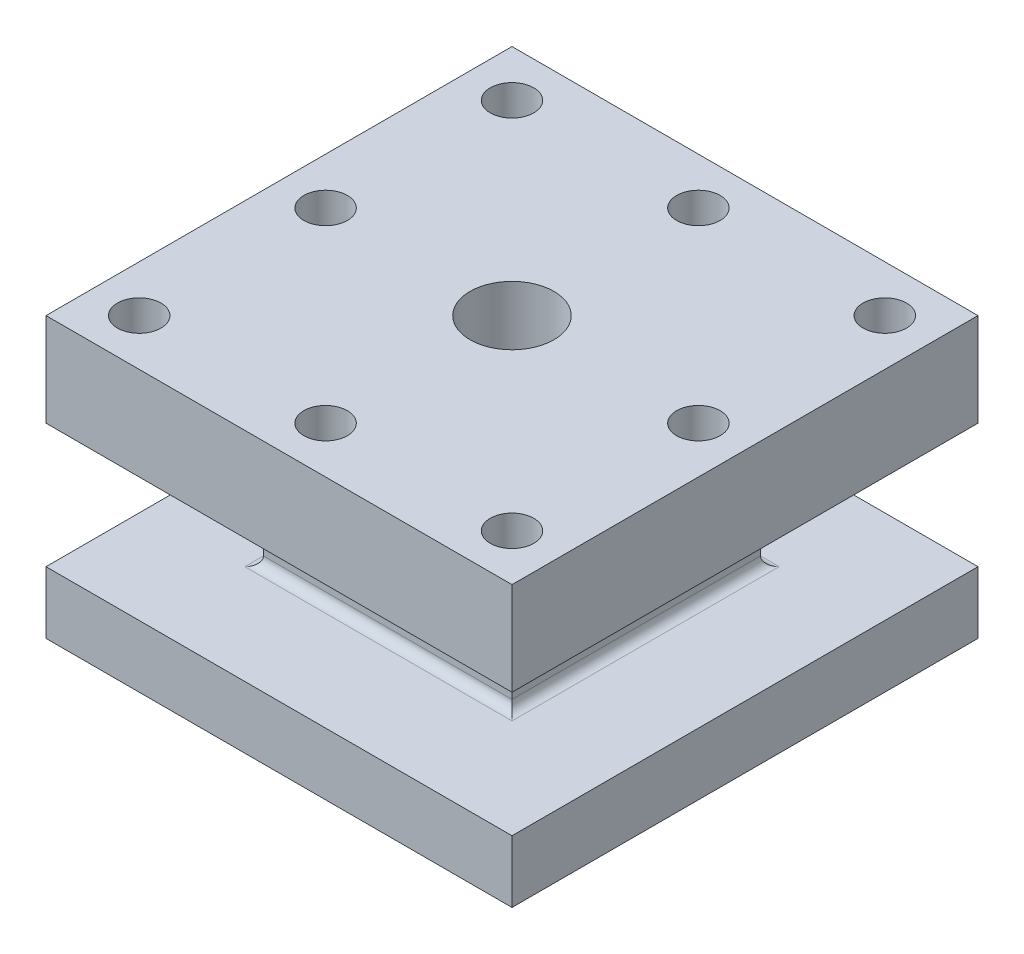
ISO-10303-21;
HEADER;
FILE_DESCRIPTION(('STEP AP214'),'2;1');
FILE_NAME('part.step','',(''),(''),'','','');
FILE_SCHEMA(('AUTOMOTIVE_DESIGN { 1 0 10303 214 1 1 1 1 }'));
ENDSEC;
DATA;
#1=APPLICATION_CONTEXT('core data for automotive mechanical design processes');
#2=APPLICATION_PROTOCOL_DEFINITION('international standard','automotive_design',2000,#1);
#3=PRODUCT_CONTEXT('',#1,'mechanical');
#4=PRODUCT('Part','Part','',(#3));
#5=PRODUCT_RELATED_PRODUCT_CATEGORY('part','',(#4));
#6=PRODUCT_DEFINITION_FORMATION('','',#4);
#7=PRODUCT_DEFINITION_CONTEXT('part definition',#1,'design');
#8=PRODUCT_DEFINITION('design','',#6,#7);
#9=PRODUCT_DEFINITION_SHAPE('','',#8);
#10=(LENGTH_UNIT() NAMED_UNIT(*) SI_UNIT(.MILLI.,.METRE.));
#11=(NAMED_UNIT(*) PLANE_ANGLE_UNIT() SI_UNIT($,.RADIAN.));
#12=(NAMED_UNIT(*) SI_UNIT($,.STERADIAN.) SOLID_ANGLE_UNIT());
#13=UNCERTAINTY_MEASURE_WITH_UNIT(LENGTH_MEASURE(1.E-05),#10,'distance_accuracy_value','');
#14=(GEOMETRIC_REPRESENTATION_CONTEXT(3) GLOBAL_UNCERTAINTY_ASSIGNED_CONTEXT((#13)) GLOBAL_UNIT_ASSIGNED_CONTEXT((#10,
#11,#12)) REPRESENTATION_CONTEXT('',''));
#15=CARTESIAN_POINT('',(0.,0.,0.));
#16=DIRECTION('',(0.,0.,1.));
#17=DIRECTION('',(1.,0.,0.));
#18=AXIS2_PLACEMENT_3D('',#15,#16,#17);
#19=CARTESIAN_POINT('',(0.,0.,0.));
#20=DIRECTION('',(0.,-1.,0.));
#21=DIRECTION('',(0.,0.,-1.));
#22=AXIS2_PLACEMENT_3D('',#19,#20,#21);
#23=PLANE('',#22);
#24=CARTESIAN_POINT('',(0.,0.,60.));
#25=DIRECTION('',(0.,1.,0.));
#26=DIRECTION('',(0.,0.,1.));
#27=AXIS2_PLACEMENT_3D('',#24,#25,#26);
#28=CIRCLE('',#27,6.99999999999999);
#29=CARTESIAN_POINT('',(0.,0.,67.));
#30=VERTEX_POINT('',#29);
#31=EDGE_CURVE('E248',#30,#30,#28,.T.);
#32=ORIENTED_EDGE('',*,*,#31,.F.);
#33=EDGE_LOOP('',(#32));
#34=FACE_BOUND('',#33,.T.);
#35=CARTESIAN_POINT('',(0.,0.,0.));
#36=DIRECTION('',(0.,-1.,0.));
#37=DIRECTION('',(0.,0.,-1.));
#38=AXIS2_PLACEMENT_3D('',#35,#36,#37);
#39=CIRCLE('',#38,13.5);
#40=CARTESIAN_POINT('',(0.,0.,-13.5));
#41=VERTEX_POINT('',#40);
#42=EDGE_CURVE('E272',#41,#41,#39,.T.);
#43=ORIENTED_EDGE('',*,*,#42,.T.);
#44=EDGE_LOOP('',(#43));
#45=FACE_BOUND('',#44,.T.);
#46=DIRECTION('',(0.,0.,1.));
#47=VECTOR('',#46,1.);
#48=CARTESIAN_POINT('',(-75.,0.,-75.));
#49=LINE('',#48,#47);
#50=CARTESIAN_POINT('',(-75.,0.,-75.));
#51=VERTEX_POINT('',#50);
#52=CARTESIAN_POINT('',(-75.,0.,75.));
#53=VERTEX_POINT('',#52);
#54=EDGE_CURVE('E346',#51,#53,#49,.T.);
#55=ORIENTED_EDGE('',*,*,#54,.T.);
#56=DIRECTION('',(1.,0.,0.));
#57=VECTOR('',#56,1.);
#58=CARTESIAN_POINT('',(75.,0.,75.));
#59=LINE('',#58,#57);
#60=CARTESIAN_POINT('',(75.,0.,75.));
#61=VERTEX_POINT('',#60);
#62=EDGE_CURVE('E368',#53,#61,#59,.T.);
#63=ORIENTED_EDGE('',*,*,#62,.T.);
#64=DIRECTION('',(0.,0.,-1.));
#65=VECTOR('',#64,1.);
#66=CARTESIAN_POINT('',(75.,0.,-75.));
#67=LINE('',#66,#65);
#68=CARTESIAN_POINT('',(75.,0.,-75.));
#69=VERTEX_POINT('',#68);
#70=EDGE_CURVE('E372',#61,#69,#67,.T.);
#71=ORIENTED_EDGE('',*,*,#70,.T.);
#72=DIRECTION('',(-1.,0.,0.));
#73=VECTOR('',#72,1.);
#74=CARTESIAN_POINT('',(75.,0.,-75.));
#75=LINE('',#74,#73);
#76=EDGE_CURVE('E352',#69,#51,#75,.T.);
#77=ORIENTED_EDGE('',*,*,#76,.T.);
#78=EDGE_LOOP('',(#55,#63,#71,#77));
#79=FACE_BOUND('',#78,.T.);
#80=CARTESIAN_POINT('',(-60.,0.,0.));
#81=DIRECTION('',(0.,1.,0.));
#82=DIRECTION('',(0.,0.,1.));
#83=AXIS2_PLACEMENT_3D('',#80,#81,#82);
#84=CIRCLE('',#83,6.99999999999999);
#85=CARTESIAN_POINT('',(-60.,0.,6.99999999999998));
#86=VERTEX_POINT('',#85);
#87=EDGE_CURVE('E256',#86,#86,#84,.T.);
#88=ORIENTED_EDGE('',*,*,#87,.F.);
#89=EDGE_LOOP('',(#88));
#90=FACE_BOUND('',#89,.T.);
#91=CARTESIAN_POINT('',(60.,0.,0.));
#92=DIRECTION('',(0.,1.,0.));
#93=DIRECTION('',(0.,0.,1.));
#94=AXIS2_PLACEMENT_3D('',#91,#92,#93);
#95=CIRCLE('',#94,6.99999999999999);
#96=CARTESIAN_POINT('',(60.,0.,6.99999999999997));
#97=VERTEX_POINT('',#96);
#98=EDGE_CURVE('E240',#97,#97,#95,.T.);
#99=ORIENTED_EDGE('',*,*,#98,.F.);
#100=EDGE_LOOP('',(#99));
#101=FACE_BOUND('',#100,.T.);
#102=CARTESIAN_POINT('',(0.,0.,-60.));
#103=DIRECTION('',(0.,1.,0.));
#104=DIRECTION('',(0.,0.,1.));
#105=AXIS2_PLACEMENT_3D('',#102,#103,#104);
#106=CIRCLE('',#105,6.99999999999999);
#107=CARTESIAN_POINT('',(0.,0.,-53.));
#108=VERTEX_POINT('',#107);
#109=EDGE_CURVE('E232',#108,#108,#106,.T.);
#110=ORIENTED_EDGE('',*,*,#109,.F.);
#111=EDGE_LOOP('',(#110));
#112=FACE_BOUND('',#111,.T.);
#113=CARTESIAN_POINT('',(-60.,0.,-60.));
#114=DIRECTION('',(0.,1.,0.));
#115=DIRECTION('',(0.,0.,1.));
#116=AXIS2_PLACEMENT_3D('',#113,#114,#115);
#117=CIRCLE('',#116,6.99999999999999);
#118=CARTESIAN_POINT('',(-60.,0.,-53.));
#119=VERTEX_POINT('',#118);
#120=EDGE_CURVE('E224',#119,#119,#117,.T.);
#121=ORIENTED_EDGE('',*,*,#120,.F.);
#122=EDGE_LOOP('',(#121));
#123=FACE_BOUND('',#122,.T.);
#124=CARTESIAN_POINT('',(60.,0.,60.));
#125=DIRECTION('',(0.,1.,0.));
#126=DIRECTION('',(0.,0.,1.));
#127=AXIS2_PLACEMENT_3D('',#124,#125,#126);
#128=CIRCLE('',#127,6.99999999999999);
#129=CARTESIAN_POINT('',(60.,0.,67.));
#130=VERTEX_POINT('',#129);
#131=EDGE_CURVE('E216',#130,#130,#128,.T.);
#132=ORIENTED_EDGE('',*,*,#131,.F.);
#133=EDGE_LOOP('',(#132));
#134=FACE_BOUND('',#133,.T.);
#135=CARTESIAN_POINT('',(60.,0.,-60.));
#136=DIRECTION('',(0.,1.,0.));
#137=DIRECTION('',(0.,0.,1.));
#138=AXIS2_PLACEMENT_3D('',#135,#136,#137);
#139=CIRCLE('',#138,6.99999999999999);
#140=CARTESIAN_POINT('',(60.,0.,-53.));
#141=VERTEX_POINT('',#140);
#142=EDGE_CURVE('E208',#141,#141,#139,.T.);
#143=ORIENTED_EDGE('',*,*,#142,.F.);
#144=EDGE_LOOP('',(#143));
#145=FACE_BOUND('',#144,.T.);
#146=CARTESIAN_POINT('',(-60.,0.,60.));
#147=DIRECTION('',(0.,1.,0.));
#148=DIRECTION('',(0.,0.,1.));
#149=AXIS2_PLACEMENT_3D('',#146,#147,#148);
#150=CIRCLE('',#149,6.99999999999999);
#151=CARTESIAN_POINT('',(-60.,0.,67.));
#152=VERTEX_POINT('',#151);
#153=EDGE_CURVE('E200',#152,#152,#150,.T.);
#154=ORIENTED_EDGE('',*,*,#153,.F.);
#155=EDGE_LOOP('',(#154));
#156=FACE_BOUND('',#155,.T.);
#157=ADVANCED_FACE('F44',(#34,#45,#79,#90,#101,#112,#123,#134,#145,#156),#23,.F.);
#158=CARTESIAN_POINT('',(-75.,-30.,-75.));
#159=DIRECTION('',(-1.,0.,0.));
#160=DIRECTION('',(0.,0.,1.));
#161=AXIS2_PLACEMENT_3D('',#158,#159,#160);
#162=PLANE('',#161);
#163=ORIENTED_EDGE('',*,*,#54,.F.);
#164=DIRECTION('',(0.,1.,0.));
#165=VECTOR('',#164,1.);
#166=CARTESIAN_POINT('',(-75.,-30.,-75.));
#167=LINE('',#166,#165);
#168=CARTESIAN_POINT('',(-75.,-30.,-75.));
#169=VERTEX_POINT('',#168);
#170=EDGE_CURVE('E379',#169,#51,#167,.T.);
#171=ORIENTED_EDGE('',*,*,#170,.F.);
#172=DIRECTION('',(0.,0.,1.));
#173=VECTOR('',#172,1.);
#174=CARTESIAN_POINT('',(-75.,-30.,-75.));
#175=LINE('',#174,#173);
#176=CARTESIAN_POINT('',(-75.,-30.,75.));
#177=VERTEX_POINT('',#176);
#178=EDGE_CURVE('E347',#169,#177,#175,.T.);
#179=ORIENTED_EDGE('',*,*,#178,.T.);
#180=DIRECTION('',(0.,1.,0.));
#181=VECTOR('',#180,1.);
#182=CARTESIAN_POINT('',(-75.,-30.,75.));
#183=LINE('',#182,#181);
#184=EDGE_CURVE('E364',#177,#53,#183,.T.);
#185=ORIENTED_EDGE('',*,*,#184,.T.);
#186=EDGE_LOOP('',(#163,#171,#179,#185));
#187=FACE_BOUND('',#186,.T.);
#188=ADVANCED_FACE('F444',(#187),#162,.T.);
#189=CARTESIAN_POINT('',(75.,-30.,-75.));
#190=DIRECTION('',(0.,0.,-1.));
#191=DIRECTION('',(-1.,0.,0.));
#192=AXIS2_PLACEMENT_3D('',#189,#190,#191);
#193=PLANE('',#192);
#194=ORIENTED_EDGE('',*,*,#76,.F.);
#195=DIRECTION('',(0.,1.,0.));
#196=VECTOR('',#195,1.);
#197=CARTESIAN_POINT('',(75.,-30.,-75.));
#198=LINE('',#197,#196);
#199=CARTESIAN_POINT('',(75.,-30.,-75.));
#200=VERTEX_POINT('',#199);
#201=EDGE_CURVE('E383',#200,#69,#198,.T.);
#202=ORIENTED_EDGE('',*,*,#201,.F.);
#203=DIRECTION('',(-1.,0.,0.));
#204=VECTOR('',#203,1.);
#205=CARTESIAN_POINT('',(75.,-30.,-75.));
#206=LINE('',#205,#204);
#207=EDGE_CURVE('E360',#200,#169,#206,.T.);
#208=ORIENTED_EDGE('',*,*,#207,.T.);
#209=ORIENTED_EDGE('',*,*,#170,.T.);
#210=EDGE_LOOP('',(#194,#202,#208,#209));
#211=FACE_BOUND('',#210,.T.);
#212=ADVANCED_FACE('F450',(#211),#193,.T.);
#213=CARTESIAN_POINT('',(75.,-30.,-75.));
#214=DIRECTION('',(1.,0.,0.));
#215=DIRECTION('',(0.,0.,-1.));
#216=AXIS2_PLACEMENT_3D('',#213,#214,#215);
#217=PLANE('',#216);
#218=ORIENTED_EDGE('',*,*,#70,.F.);
#219=DIRECTION('',(0.,1.,0.));
#220=VECTOR('',#219,1.);
#221=CARTESIAN_POINT('',(75.,-30.,75.));
#222=LINE('',#221,#220);
#223=CARTESIAN_POINT('',(75.,-30.,75.));
#224=VERTEX_POINT('',#223);
#225=EDGE_CURVE('E386',#224,#61,#222,.T.);
#226=ORIENTED_EDGE('',*,*,#225,.F.);
#227=DIRECTION('',(0.,0.,-1.));
#228=VECTOR('',#227,1.);
#229=CARTESIAN_POINT('',(75.,-30.,-75.));
#230=LINE('',#229,#228);
#231=EDGE_CURVE('E356',#224,#200,#230,.T.);
#232=ORIENTED_EDGE('',*,*,#231,.T.);
#233=ORIENTED_EDGE('',*,*,#201,.T.);
#234=EDGE_LOOP('',(#218,#226,#232,#233));
#235=FACE_BOUND('',#234,.T.);
#236=ADVANCED_FACE('F461',(#235),#217,.T.);
#237=CARTESIAN_POINT('',(75.,-30.,75.));
#238=DIRECTION('',(0.,0.,1.));
#239=DIRECTION('',(1.,0.,0.));
#240=AXIS2_PLACEMENT_3D('',#237,#238,#239);
#241=PLANE('',#240);
#242=ORIENTED_EDGE('',*,*,#62,.F.);
#243=ORIENTED_EDGE('',*,*,#184,.F.);
#244=DIRECTION('',(1.,0.,0.));
#245=VECTOR('',#244,1.);
#246=CARTESIAN_POINT('',(75.,-30.,75.));
#247=LINE('',#246,#245);
#248=EDGE_CURVE('E351',#177,#224,#247,.T.);
#249=ORIENTED_EDGE('',*,*,#248,.T.);
#250=ORIENTED_EDGE('',*,*,#225,.T.);
#251=EDGE_LOOP('',(#242,#243,#249,#250));
#252=FACE_BOUND('',#251,.T.);
#253=ADVANCED_FACE('F465',(#252),#241,.T.);
#254=CARTESIAN_POINT('',(0.,-30.,0.));
#255=DIRECTION('',(0.,-1.,0.));
#256=DIRECTION('',(0.,0.,-1.));
#257=AXIS2_PLACEMENT_3D('',#254,#255,#256);
#258=PLANE('',#257);
#259=CARTESIAN_POINT('',(-60.,-30.,60.));
#260=DIRECTION('',(0.,-1.,0.));
#261=DIRECTION('',(0.,0.,-1.));
#262=AXIS2_PLACEMENT_3D('',#259,#260,#261);
#263=CIRCLE('',#262,6.99999999999999);
#264=CARTESIAN_POINT('',(-60.,-30.,53.));
#265=VERTEX_POINT('',#264);
#266=EDGE_CURVE('E204',#265,#265,#263,.T.);
#267=ORIENTED_EDGE('',*,*,#266,.F.);
#268=EDGE_LOOP('',(#267));
#269=FACE_BOUND('',#268,.T.);
#270=CARTESIAN_POINT('',(60.,-30.,-60.));
#271=DIRECTION('',(0.,-1.,0.));
#272=DIRECTION('',(0.,0.,-1.));
#273=AXIS2_PLACEMENT_3D('',#270,#271,#272);
#274=CIRCLE('',#273,6.99999999999999);
#275=CARTESIAN_POINT('',(60.,-30.,-67.));
#276=VERTEX_POINT('',#275);
#277=EDGE_CURVE('E212',#276,#276,#274,.T.);
#278=ORIENTED_EDGE('',*,*,#277,.F.);
#279=EDGE_LOOP('',(#278));
#280=FACE_BOUND('',#279,.T.);
#281=CARTESIAN_POINT('',(60.,-30.,60.));
#282=DIRECTION('',(0.,-1.,0.));
#283=DIRECTION('',(0.,0.,-1.));
#284=AXIS2_PLACEMENT_3D('',#281,#282,#283);
#285=CIRCLE('',#284,6.99999999999999);
#286=CARTESIAN_POINT('',(60.,-30.,53.));
#287=VERTEX_POINT('',#286);
#288=EDGE_CURVE('E220',#287,#287,#285,.T.);
#289=ORIENTED_EDGE('',*,*,#288,.F.);
#290=EDGE_LOOP('',(#289));
#291=FACE_BOUND('',#290,.T.);
#292=CARTESIAN_POINT('',(-60.,-30.,-60.));
#293=DIRECTION('',(0.,-1.,0.));
#294=DIRECTION('',(0.,0.,-1.));
#295=AXIS2_PLACEMENT_3D('',#292,#293,#294);
#296=CIRCLE('',#295,6.99999999999999);
#297=CARTESIAN_POINT('',(-60.,-30.,-67.));
#298=VERTEX_POINT('',#297);
#299=EDGE_CURVE('E228',#298,#298,#296,.T.);
#300=ORIENTED_EDGE('',*,*,#299,.F.);
#301=EDGE_LOOP('',(#300));
#302=FACE_BOUND('',#301,.T.);
#303=CARTESIAN_POINT('',(0.,-30.,-60.));
#304=DIRECTION('',(0.,-1.,0.));
#305=DIRECTION('',(0.,0.,-1.));
#306=AXIS2_PLACEMENT_3D('',#303,#304,#305);
#307=CIRCLE('',#306,6.99999999999999);
#308=CARTESIAN_POINT('',(0.,-30.,-67.));
#309=VERTEX_POINT('',#308);
#310=EDGE_CURVE('E236',#309,#309,#307,.T.);
#311=ORIENTED_EDGE('',*,*,#310,.F.);
#312=EDGE_LOOP('',(#311));
#313=FACE_BOUND('',#312,.T.);
#314=CARTESIAN_POINT('',(60.,-30.,0.));
#315=DIRECTION('',(0.,-1.,0.));
#316=DIRECTION('',(0.,0.,-1.));
#317=AXIS2_PLACEMENT_3D('',#314,#315,#316);
#318=CIRCLE('',#317,6.99999999999999);
#319=CARTESIAN_POINT('',(60.,-30.,-7.00000000000001));
#320=VERTEX_POINT('',#319);
#321=EDGE_CURVE('E244',#320,#320,#318,.T.);
#322=ORIENTED_EDGE('',*,*,#321,.F.);
#323=EDGE_LOOP('',(#322));
#324=FACE_BOUND('',#323,.T.);
#325=CARTESIAN_POINT('',(0.,-30.,60.));
#326=DIRECTION('',(0.,-1.,0.));
#327=DIRECTION('',(0.,0.,-1.));
#328=AXIS2_PLACEMENT_3D('',#325,#326,#327);
#329=CIRCLE('',#328,6.99999999999999);
#330=CARTESIAN_POINT('',(0.,-30.,53.));
#331=VERTEX_POINT('',#330);
#332=EDGE_CURVE('E252',#331,#331,#329,.T.);
#333=ORIENTED_EDGE('',*,*,#332,.F.);
#334=EDGE_LOOP('',(#333));
#335=FACE_BOUND('',#334,.T.);
#336=CARTESIAN_POINT('',(-60.,-30.,0.));
#337=DIRECTION('',(0.,-1.,0.));
#338=DIRECTION('',(0.,0.,-1.));
#339=AXIS2_PLACEMENT_3D('',#336,#337,#338);
#340=CIRCLE('',#339,6.99999999999999);
#341=CARTESIAN_POINT('',(-60.,-30.,-6.99999999999999));
#342=VERTEX_POINT('',#341);
#343=EDGE_CURVE('E260',#342,#342,#340,.T.);
#344=ORIENTED_EDGE('',*,*,#343,.F.);
#345=EDGE_LOOP('',(#344));
#346=FACE_BOUND('',#345,.T.);
#347=DIRECTION('',(0.,0.,-1.));
#348=VECTOR('',#347,1.);
#349=CARTESIAN_POINT('',(-40.,-30.,40.));
#350=LINE('',#349,#348);
#351=CARTESIAN_POINT('',(-40.,-30.,40.));
#352=VERTEX_POINT('',#351);
#353=CARTESIAN_POINT('',(-40.,-30.,-40.));
#354=VERTEX_POINT('',#353);
#355=EDGE_CURVE('E318',#352,#354,#350,.T.);
#356=ORIENTED_EDGE('',*,*,#355,.F.);
#357=DIRECTION('',(-1.,0.,0.));
#358=VECTOR('',#357,1.);
#359=CARTESIAN_POINT('',(40.,-30.,40.));
#360=LINE('',#359,#358);
#361=CARTESIAN_POINT('',(40.,-30.,40.));
#362=VERTEX_POINT('',#361);
#363=EDGE_CURVE('E330',#362,#352,#360,.T.);
#364=ORIENTED_EDGE('',*,*,#363,.F.);
#365=DIRECTION('',(0.,0.,1.));
#366=VECTOR('',#365,1.);
#367=CARTESIAN_POINT('',(40.,-30.,40.));
#368=LINE('',#367,#366);
#369=CARTESIAN_POINT('',(40.,-30.,-40.));
#370=VERTEX_POINT('',#369);
#371=EDGE_CURVE('E326',#370,#362,#368,.T.);
#372=ORIENTED_EDGE('',*,*,#371,.F.);
#373=DIRECTION('',(1.,0.,0.));
#374=VECTOR('',#373,1.);
#375=CARTESIAN_POINT('',(40.,-30.,-40.));
#376=LINE('',#375,#374);
#377=EDGE_CURVE('E322',#354,#370,#376,.T.);
#378=ORIENTED_EDGE('',*,*,#377,.F.);
#379=EDGE_LOOP('',(#356,#364,#372,#378));
#380=FACE_BOUND('',#379,.T.);
#381=ORIENTED_EDGE('',*,*,#178,.F.);
#382=ORIENTED_EDGE('',*,*,#207,.F.);
#383=ORIENTED_EDGE('',*,*,#231,.F.);
#384=ORIENTED_EDGE('',*,*,#248,.F.);
#385=EDGE_LOOP('',(#381,#382,#383,#384));
#386=FACE_BOUND('',#385,.T.);
#387=ADVANCED_FACE('F457',(#269,#280,#291,#302,#313,#324,#335,#346,#380,#386),#258,.T.);
#388=CARTESIAN_POINT('',(-40.,-70.,40.));
#389=DIRECTION('',(1.,0.,0.));
#390=DIRECTION('',(0.,0.,-1.));
#391=AXIS2_PLACEMENT_3D('',#388,#389,#390);
#392=PLANE('',#391);
#393=DIRECTION('',(0.,1.,0.));
#394=VECTOR('',#393,1.);
#395=CARTESIAN_POINT('',(-40.,-70.,-40.));
#396=LINE('',#395,#394);
#397=CARTESIAN_POINT('',(-40.,-67.,-40.));
#398=VERTEX_POINT('',#397);
#399=EDGE_CURVE('E343',#398,#354,#396,.T.);
#400=ORIENTED_EDGE('',*,*,#399,.F.);
#401=DIRECTION('',(0.,0.,-1.));
#402=VECTOR('',#401,1.);
#403=CARTESIAN_POINT('',(-40.,-67.,40.));
#404=LINE('',#403,#402);
#405=CARTESIAN_POINT('',(-40.,-67.,40.));
#406=VERTEX_POINT('',#405);
#407=EDGE_CURVE('E69',#398,#406,#404,.F.);
#408=ORIENTED_EDGE('',*,*,#407,.T.);
#409=DIRECTION('',(0.,1.,0.));
#410=VECTOR('',#409,1.);
#411=CARTESIAN_POINT('',(-40.,-70.,40.));
#412=LINE('',#411,#410);
#413=EDGE_CURVE('E334',#406,#352,#412,.T.);
#414=ORIENTED_EDGE('',*,*,#413,.T.);
#415=ORIENTED_EDGE('',*,*,#355,.T.);
#416=EDGE_LOOP('',(#400,#408,#414,#415));
#417=FACE_BOUND('',#416,.T.);
#418=ADVANCED_FACE('F554',(#417),#392,.F.);
#419=CARTESIAN_POINT('',(40.,-70.,-40.));
#420=DIRECTION('',(0.,0.,1.));
#421=DIRECTION('',(1.,0.,0.));
#422=AXIS2_PLACEMENT_3D('',#419,#420,#421);
#423=PLANE('',#422);
#424=DIRECTION('',(0.,1.,0.));
#425=VECTOR('',#424,1.);
#426=CARTESIAN_POINT('',(40.,-70.,-40.));
#427=LINE('',#426,#425);
#428=CARTESIAN_POINT('',(40.,-67.,-40.));
#429=VERTEX_POINT('',#428);
#430=EDGE_CURVE('E340',#429,#370,#427,.T.);
#431=ORIENTED_EDGE('',*,*,#430,.F.);
#432=DIRECTION('',(1.,0.,0.));
#433=VECTOR('',#432,1.);
#434=CARTESIAN_POINT('',(-40.,-67.,-40.));
#435=LINE('',#434,#433);
#436=EDGE_CURVE('E403',#429,#398,#435,.F.);
#437=ORIENTED_EDGE('',*,*,#436,.T.);
#438=ORIENTED_EDGE('',*,*,#399,.T.);
#439=ORIENTED_EDGE('',*,*,#377,.T.);
#440=EDGE_LOOP('',(#431,#437,#438,#439));
#441=FACE_BOUND('',#440,.T.);
#442=ADVANCED_FACE('F495',(#441),#423,.F.);
#443=CARTESIAN_POINT('',(40.,-70.,40.));
#444=DIRECTION('',(-1.,0.,0.));
#445=DIRECTION('',(0.,0.,1.));
#446=AXIS2_PLACEMENT_3D('',#443,#444,#445);
#447=PLANE('',#446);
#448=DIRECTION('',(0.,1.,0.));
#449=VECTOR('',#448,1.);
#450=CARTESIAN_POINT('',(40.,-70.,40.));
#451=LINE('',#450,#449);
#452=CARTESIAN_POINT('',(40.,-67.,40.));
#453=VERTEX_POINT('',#452);
#454=EDGE_CURVE('E337',#453,#362,#451,.T.);
#455=ORIENTED_EDGE('',*,*,#454,.F.);
#456=DIRECTION('',(0.,0.,1.));
#457=VECTOR('',#456,1.);
#458=CARTESIAN_POINT('',(40.,-67.,-40.));
#459=LINE('',#458,#457);
#460=EDGE_CURVE('E411',#453,#429,#459,.F.);
#461=ORIENTED_EDGE('',*,*,#460,.T.);
#462=ORIENTED_EDGE('',*,*,#430,.T.);
#463=ORIENTED_EDGE('',*,*,#371,.T.);
#464=EDGE_LOOP('',(#455,#461,#462,#463));
#465=FACE_BOUND('',#464,.T.);
#466=ADVANCED_FACE('F491',(#465),#447,.F.);
#467=CARTESIAN_POINT('',(40.,-70.,40.));
#468=DIRECTION('',(0.,0.,-1.));
#469=DIRECTION('',(-1.,0.,0.));
#470=AXIS2_PLACEMENT_3D('',#467,#468,#469);
#471=PLANE('',#470);
#472=ORIENTED_EDGE('',*,*,#413,.F.);
#473=DIRECTION('',(-1.,0.,0.));
#474=VECTOR('',#473,1.);
#475=CARTESIAN_POINT('',(40.,-67.,40.));
#476=LINE('',#475,#474);
#477=EDGE_CURVE('E61',#406,#453,#476,.F.);
#478=ORIENTED_EDGE('',*,*,#477,.T.);
#479=ORIENTED_EDGE('',*,*,#454,.T.);
#480=ORIENTED_EDGE('',*,*,#363,.T.);
#481=EDGE_LOOP('',(#472,#478,#479,#480));
#482=FACE_BOUND('',#481,.T.);
#483=ADVANCED_FACE('F505',(#482),#471,.F.);
#484=CARTESIAN_POINT('',(0.,-70.,0.));
#485=DIRECTION('',(0.,-1.,0.));
#486=DIRECTION('',(0.,0.,-1.));
#487=AXIS2_PLACEMENT_3D('',#484,#485,#486);
#488=PLANE('',#487);
#489=DIRECTION('',(0.,0.,-1.));
#490=VECTOR('',#489,1.);
#491=CARTESIAN_POINT('',(-43.,-70.,-40.));
#492=LINE('',#491,#490);
#493=CARTESIAN_POINT('',(-43.,-70.,43.));
#494=VERTEX_POINT('',#493);
#495=CARTESIAN_POINT('',(-43.,-70.,-43.));
#496=VERTEX_POINT('',#495);
#497=EDGE_CURVE('E396',#494,#496,#492,.T.);
#498=ORIENTED_EDGE('',*,*,#497,.T.);
#499=DIRECTION('',(1.,0.,0.));
#500=VECTOR('',#499,1.);
#501=CARTESIAN_POINT('',(40.,-70.,-43.));
#502=LINE('',#501,#500);
#503=CARTESIAN_POINT('',(43.,-70.,-43.));
#504=VERTEX_POINT('',#503);
#505=EDGE_CURVE('E399',#496,#504,#502,.T.);
#506=ORIENTED_EDGE('',*,*,#505,.T.);
#507=DIRECTION('',(0.,0.,1.));
#508=VECTOR('',#507,1.);
#509=CARTESIAN_POINT('',(43.,-70.,40.));
#510=LINE('',#509,#508);
#511=CARTESIAN_POINT('',(43.,-70.,43.));
#512=VERTEX_POINT('',#511);
#513=EDGE_CURVE('E382',#504,#512,#510,.T.);
#514=ORIENTED_EDGE('',*,*,#513,.T.);
#515=DIRECTION('',(-1.,0.,0.));
#516=VECTOR('',#515,1.);
#517=CARTESIAN_POINT('',(-40.,-70.,43.));
#518=LINE('',#517,#516);
#519=EDGE_CURVE('E393',#512,#494,#518,.T.);
#520=ORIENTED_EDGE('',*,*,#519,.T.);
#521=EDGE_LOOP('',(#498,#506,#514,#520));
#522=FACE_BOUND('',#521,.T.);
#523=DIRECTION('',(0.,0.,1.));
#524=VECTOR('',#523,1.);
#525=CARTESIAN_POINT('',(75.,-70.,-75.));
#526=LINE('',#525,#524);
#527=CARTESIAN_POINT('',(75.,-70.,-75.));
#528=VERTEX_POINT('',#527);
#529=CARTESIAN_POINT('',(75.,-70.,75.));
#530=VERTEX_POINT('',#529);
#531=EDGE_CURVE('E276',#528,#530,#526,.T.);
#532=ORIENTED_EDGE('',*,*,#531,.F.);
#533=DIRECTION('',(1.,0.,0.));
#534=VECTOR('',#533,1.);
#535=CARTESIAN_POINT('',(-75.,-70.,-75.));
#536=LINE('',#535,#534);
#537=CARTESIAN_POINT('',(-75.,-70.,-75.));
#538=VERTEX_POINT('',#537);
#539=EDGE_CURVE('E282',#538,#528,#536,.T.);
#540=ORIENTED_EDGE('',*,*,#539,.F.);
#541=DIRECTION('',(0.,0.,-1.));
#542=VECTOR('',#541,1.);
#543=CARTESIAN_POINT('',(-75.,-70.,75.));
#544=LINE('',#543,#542);
#545=CARTESIAN_POINT('',(-75.,-70.,75.));
#546=VERTEX_POINT('',#545);
#547=EDGE_CURVE('E298',#546,#538,#544,.T.);
#548=ORIENTED_EDGE('',*,*,#547,.F.);
#549=DIRECTION('',(-1.,0.,0.));
#550=VECTOR('',#549,1.);
#551=CARTESIAN_POINT('',(75.,-70.,75.));
#552=LINE('',#551,#550);
#553=EDGE_CURVE('E295',#530,#546,#552,.T.);
#554=ORIENTED_EDGE('',*,*,#553,.F.);
#555=EDGE_LOOP('',(#532,#540,#548,#554));
#556=FACE_BOUND('',#555,.T.);
#557=ADVANCED_FACE('F501',(#522,#556),#488,.F.);
#558=CARTESIAN_POINT('',(75.,-90.,-75.));
#559=DIRECTION('',(-1.,0.,0.));
#560=DIRECTION('',(0.,0.,1.));
#561=AXIS2_PLACEMENT_3D('',#558,#559,#560);
#562=PLANE('',#561);
#563=ORIENTED_EDGE('',*,*,#531,.T.);
#564=DIRECTION('',(0.,1.,0.));
#565=VECTOR('',#564,1.);
#566=CARTESIAN_POINT('',(75.,-90.,75.));
#567=LINE('',#566,#565);
#568=CARTESIAN_POINT('',(75.,-90.,75.));
#569=VERTEX_POINT('',#568);
#570=EDGE_CURVE('E314',#569,#530,#567,.T.);
#571=ORIENTED_EDGE('',*,*,#570,.F.);
#572=DIRECTION('',(0.,0.,1.));
#573=VECTOR('',#572,1.);
#574=CARTESIAN_POINT('',(75.,-90.,-75.));
#575=LINE('',#574,#573);
#576=CARTESIAN_POINT('',(75.,-90.,-75.));
#577=VERTEX_POINT('',#576);
#578=EDGE_CURVE('E277',#577,#569,#575,.T.);
#579=ORIENTED_EDGE('',*,*,#578,.F.);
#580=DIRECTION('',(0.,1.,0.));
#581=VECTOR('',#580,1.);
#582=CARTESIAN_POINT('',(75.,-90.,-75.));
#583=LINE('',#582,#581);
#584=EDGE_CURVE('E291',#577,#528,#583,.T.);
#585=ORIENTED_EDGE('',*,*,#584,.T.);
#586=EDGE_LOOP('',(#563,#571,#579,#585));
#587=FACE_BOUND('',#586,.T.);
#588=ADVANCED_FACE('F504',(#587),#562,.F.);
#589=CARTESIAN_POINT('',(75.,-90.,75.));
#590=DIRECTION('',(0.,0.,-1.));
#591=DIRECTION('',(-1.,0.,0.));
#592=AXIS2_PLACEMENT_3D('',#589,#590,#591);
#593=PLANE('',#592);
#594=ORIENTED_EDGE('',*,*,#553,.T.);
#595=DIRECTION('',(0.,1.,0.));
#596=VECTOR('',#595,1.);
#597=CARTESIAN_POINT('',(-75.,-90.,75.));
#598=LINE('',#597,#596);
#599=CARTESIAN_POINT('',(-75.,-90.,75.));
#600=VERTEX_POINT('',#599);
#601=EDGE_CURVE('E310',#600,#546,#598,.T.);
#602=ORIENTED_EDGE('',*,*,#601,.F.);
#603=DIRECTION('',(-1.,0.,0.));
#604=VECTOR('',#603,1.);
#605=CARTESIAN_POINT('',(75.,-90.,75.));
#606=LINE('',#605,#604);
#607=EDGE_CURVE('E281',#569,#600,#606,.T.);
#608=ORIENTED_EDGE('',*,*,#607,.F.);
#609=ORIENTED_EDGE('',*,*,#570,.T.);
#610=EDGE_LOOP('',(#594,#602,#608,#609));
#611=FACE_BOUND('',#610,.T.);
#612=ADVANCED_FACE('F523',(#611),#593,.F.);
#613=CARTESIAN_POINT('',(-75.,-90.,75.));
#614=DIRECTION('',(1.,0.,0.));
#615=DIRECTION('',(0.,0.,-1.));
#616=AXIS2_PLACEMENT_3D('',#613,#614,#615);
#617=PLANE('',#616);
#618=ORIENTED_EDGE('',*,*,#547,.T.);
#619=DIRECTION('',(0.,1.,0.));
#620=VECTOR('',#619,1.);
#621=CARTESIAN_POINT('',(-75.,-90.,-75.));
#622=LINE('',#621,#620);
#623=CARTESIAN_POINT('',(-75.,-90.,-75.));
#624=VERTEX_POINT('',#623);
#625=EDGE_CURVE('E306',#624,#538,#622,.T.);
#626=ORIENTED_EDGE('',*,*,#625,.F.);
#627=DIRECTION('',(0.,0.,-1.));
#628=VECTOR('',#627,1.);
#629=CARTESIAN_POINT('',(-75.,-90.,75.));
#630=LINE('',#629,#628);
#631=EDGE_CURVE('E285',#600,#624,#630,.T.);
#632=ORIENTED_EDGE('',*,*,#631,.F.);
#633=ORIENTED_EDGE('',*,*,#601,.T.);
#634=EDGE_LOOP('',(#618,#626,#632,#633));
#635=FACE_BOUND('',#634,.T.);
#636=ADVANCED_FACE('F520',(#635),#617,.F.);
#637=CARTESIAN_POINT('',(-75.,-90.,-75.));
#638=DIRECTION('',(0.,0.,1.));
#639=DIRECTION('',(1.,0.,0.));
#640=AXIS2_PLACEMENT_3D('',#637,#638,#639);
#641=PLANE('',#640);
#642=ORIENTED_EDGE('',*,*,#539,.T.);
#643=ORIENTED_EDGE('',*,*,#584,.F.);
#644=DIRECTION('',(1.,0.,0.));
#645=VECTOR('',#644,1.);
#646=CARTESIAN_POINT('',(-75.,-90.,-75.));
#647=LINE('',#646,#645);
#648=EDGE_CURVE('E288',#624,#577,#647,.T.);
#649=ORIENTED_EDGE('',*,*,#648,.F.);
#650=ORIENTED_EDGE('',*,*,#625,.T.);
#651=EDGE_LOOP('',(#642,#643,#649,#650));
#652=FACE_BOUND('',#651,.T.);
#653=ADVANCED_FACE('F516',(#652),#641,.F.);
#654=CARTESIAN_POINT('',(0.,-90.,0.));
#655=DIRECTION('',(0.,-1.,0.));
#656=DIRECTION('',(0.,0.,-1.));
#657=AXIS2_PLACEMENT_3D('',#654,#655,#656);
#658=PLANE('',#657);
#659=CARTESIAN_POINT('',(0.,-90.,0.));
#660=DIRECTION('',(0.,-1.,0.));
#661=DIRECTION('',(0.,0.,-1.));
#662=AXIS2_PLACEMENT_3D('',#659,#660,#661);
#663=CIRCLE('',#662,32.);
#664=CARTESIAN_POINT('',(0.,-90.,-32.));
#665=VERTEX_POINT('',#664);
#666=EDGE_CURVE('E11',#665,#665,#663,.F.);
#667=ORIENTED_EDGE('',*,*,#666,.T.);
#668=EDGE_LOOP('',(#667));
#669=FACE_BOUND('',#668,.T.);
#670=CARTESIAN_POINT('',(60.,-90.,0.));
#671=DIRECTION('',(0.,-1.,0.));
#672=DIRECTION('',(0.,0.,-1.));
#673=AXIS2_PLACEMENT_3D('',#670,#671,#672);
#674=CIRCLE('',#673,4.99999999999999);
#675=CARTESIAN_POINT('',(60.,-90.,-5.));
#676=VERTEX_POINT('',#675);
#677=EDGE_CURVE('E170',#676,#676,#674,.T.);
#678=ORIENTED_EDGE('',*,*,#677,.F.);
#679=EDGE_LOOP('',(#678));
#680=FACE_BOUND('',#679,.T.);
#681=CARTESIAN_POINT('',(-60.,-90.,0.));
#682=DIRECTION('',(0.,-1.,0.));
#683=DIRECTION('',(0.,0.,-1.));
#684=AXIS2_PLACEMENT_3D('',#681,#682,#683);
#685=CIRCLE('',#684,4.99999999999999);
#686=CARTESIAN_POINT('',(-60.,-90.,-5.00000000000001));
#687=VERTEX_POINT('',#686);
#688=EDGE_CURVE('E169',#687,#687,#685,.T.);
#689=ORIENTED_EDGE('',*,*,#688,.F.);
#690=EDGE_LOOP('',(#689));
#691=FACE_BOUND('',#690,.T.);
#692=CARTESIAN_POINT('',(0.,-90.,-60.));
#693=DIRECTION('',(0.,-1.,0.));
#694=DIRECTION('',(0.,0.,-1.));
#695=AXIS2_PLACEMENT_3D('',#692,#693,#694);
#696=CIRCLE('',#695,4.99999999999999);
#697=CARTESIAN_POINT('',(0.,-90.,-65.));
#698=VERTEX_POINT('',#697);
#699=EDGE_CURVE('E184',#698,#698,#696,.T.);
#700=ORIENTED_EDGE('',*,*,#699,.F.);
#701=EDGE_LOOP('',(#700));
#702=FACE_BOUND('',#701,.T.);
#703=CARTESIAN_POINT('',(0.,-90.,60.));
#704=DIRECTION('',(0.,-1.,0.));
#705=DIRECTION('',(0.,0.,-1.));
#706=AXIS2_PLACEMENT_3D('',#703,#704,#705);
#707=CIRCLE('',#706,4.99999999999999);
#708=CARTESIAN_POINT('',(0.,-90.,55.));
#709=VERTEX_POINT('',#708);
#710=EDGE_CURVE('E192',#709,#709,#707,.T.);
#711=ORIENTED_EDGE('',*,*,#710,.F.);
#712=EDGE_LOOP('',(#711));
#713=FACE_BOUND('',#712,.T.);
#714=ORIENTED_EDGE('',*,*,#578,.T.);
#715=ORIENTED_EDGE('',*,*,#607,.T.);
#716=ORIENTED_EDGE('',*,*,#631,.T.);
#717=ORIENTED_EDGE('',*,*,#648,.T.);
#718=EDGE_LOOP('',(#714,#715,#716,#717));
#719=FACE_BOUND('',#718,.T.);
#720=ADVANCED_FACE('F525',(#669,#680,#691,#702,#713,#719),#658,.T.);
#721=CARTESIAN_POINT('',(0.,-90.,0.));
#722=DIRECTION('',(0.,-1.,0.));
#723=DIRECTION('',(0.,0.,-1.));
#724=AXIS2_PLACEMENT_3D('',#721,#722,#723);
#725=CYLINDRICAL_SURFACE('',#724,13.5);
#726=ORIENTED_EDGE('',*,*,#42,.F.);
#727=EDGE_LOOP('',(#726));
#728=FACE_BOUND('',#727,.T.);
#729=CARTESIAN_POINT('',(0.,-80.,0.));
#730=DIRECTION('',(0.,-1.,0.));
#731=DIRECTION('',(0.,0.,-1.));
#732=AXIS2_PLACEMENT_3D('',#729,#730,#731);
#733=CIRCLE('',#732,13.5);
#734=CARTESIAN_POINT('',(0.,-80.,-13.5));
#735=VERTEX_POINT('',#734);
#736=EDGE_CURVE('E268',#735,#735,#733,.T.);
#737=ORIENTED_EDGE('',*,*,#736,.T.);
#738=EDGE_LOOP('',(#737));
#739=FACE_BOUND('',#738,.T.);
#740=ADVANCED_FACE('F527',(#728,#739),#725,.F.);
#741=CARTESIAN_POINT('',(13.5,-80.,0.));
#742=DIRECTION('',(0.,1.,0.));
#743=DIRECTION('',(0.,0.,1.));
#744=AXIS2_PLACEMENT_3D('',#741,#742,#743);
#745=PLANE('',#744);
#746=ORIENTED_EDGE('',*,*,#736,.F.);
#747=EDGE_LOOP('',(#746));
#748=FACE_BOUND('',#747,.T.);
#749=CARTESIAN_POINT('',(0.,-80.,0.));
#750=DIRECTION('',(0.,-1.,0.));
#751=DIRECTION('',(0.,0.,-1.));
#752=AXIS2_PLACEMENT_3D('',#749,#750,#751);
#753=CIRCLE('',#752,30.);
#754=CARTESIAN_POINT('',(0.,-80.,-30.));
#755=VERTEX_POINT('',#754);
#756=EDGE_CURVE('E264',#755,#755,#753,.T.);
#757=ORIENTED_EDGE('',*,*,#756,.T.);
#758=EDGE_LOOP('',(#757));
#759=FACE_BOUND('',#758,.T.);
#760=ADVANCED_FACE('F535',(#748,#759),#745,.F.);
#761=CARTESIAN_POINT('',(0.,-90.,0.));
#762=DIRECTION('',(0.,-1.,0.));
#763=DIRECTION('',(0.,0.,-1.));
#764=AXIS2_PLACEMENT_3D('',#761,#762,#763);
#765=CYLINDRICAL_SURFACE('',#764,30.);
#766=CARTESIAN_POINT('',(0.,-88.0000000000001,0.));
#767=DIRECTION('',(0.,-1.,0.));
#768=DIRECTION('',(0.,0.,-1.));
#769=AXIS2_PLACEMENT_3D('',#766,#767,#768);
#770=CIRCLE('',#769,30.);
#771=CARTESIAN_POINT('',(0.,-88.0000000000001,-30.));
#772=VERTEX_POINT('',#771);
#773=EDGE_CURVE('E54',#772,#772,#770,.T.);
#774=ORIENTED_EDGE('',*,*,#773,.T.);
#775=EDGE_LOOP('',(#774));
#776=FACE_BOUND('',#775,.T.);
#777=ORIENTED_EDGE('',*,*,#756,.F.);
#778=EDGE_LOOP('',(#777));
#779=FACE_BOUND('',#778,.T.);
#780=ADVANCED_FACE('F430',(#776,#779),#765,.F.);
#781=CARTESIAN_POINT('',(-60.,0.,0.));
#782=DIRECTION('',(0.,1.,0.));
#783=DIRECTION('',(0.,0.,1.));
#784=AXIS2_PLACEMENT_3D('',#781,#782,#783);
#785=CYLINDRICAL_SURFACE('',#784,6.99999999999999);
#786=ORIENTED_EDGE('',*,*,#87,.T.);
#787=EDGE_LOOP('',(#786));
#788=FACE_BOUND('',#787,.T.);
#789=ORIENTED_EDGE('',*,*,#343,.T.);
#790=EDGE_LOOP('',(#789));
#791=FACE_BOUND('',#790,.T.);
#792=ADVANCED_FACE('F611',(#788,#791),#785,.F.);
#793=CARTESIAN_POINT('',(0.,0.,60.));
#794=DIRECTION('',(0.,1.,0.));
#795=DIRECTION('',(0.,0.,1.));
#796=AXIS2_PLACEMENT_3D('',#793,#794,#795);
#797=CYLINDRICAL_SURFACE('',#796,6.99999999999999);
#798=ORIENTED_EDGE('',*,*,#31,.T.);
#799=EDGE_LOOP('',(#798));
#800=FACE_BOUND('',#799,.T.);
#801=ORIENTED_EDGE('',*,*,#332,.T.);
#802=EDGE_LOOP('',(#801));
#803=FACE_BOUND('',#802,.T.);
#804=ADVANCED_FACE('F613',(#800,#803),#797,.F.);
#805=CARTESIAN_POINT('',(60.,0.,0.));
#806=DIRECTION('',(0.,1.,0.));
#807=DIRECTION('',(0.,0.,1.));
#808=AXIS2_PLACEMENT_3D('',#805,#806,#807);
#809=CYLINDRICAL_SURFACE('',#808,6.99999999999999);
#810=ORIENTED_EDGE('',*,*,#98,.T.);
#811=EDGE_LOOP('',(#810));
#812=FACE_BOUND('',#811,.T.);
#813=ORIENTED_EDGE('',*,*,#321,.T.);
#814=EDGE_LOOP('',(#813));
#815=FACE_BOUND('',#814,.T.);
#816=ADVANCED_FACE('F620',(#812,#815),#809,.F.);
#817=CARTESIAN_POINT('',(0.,0.,-60.));
#818=DIRECTION('',(0.,1.,0.));
#819=DIRECTION('',(0.,0.,1.));
#820=AXIS2_PLACEMENT_3D('',#817,#818,#819);
#821=CYLINDRICAL_SURFACE('',#820,6.99999999999999);
#822=ORIENTED_EDGE('',*,*,#109,.T.);
#823=EDGE_LOOP('',(#822));
#824=FACE_BOUND('',#823,.T.);
#825=ORIENTED_EDGE('',*,*,#310,.T.);
#826=EDGE_LOOP('',(#825));
#827=FACE_BOUND('',#826,.T.);
#828=ADVANCED_FACE('F759',(#824,#827),#821,.F.);
#829=CARTESIAN_POINT('',(-60.,0.,-60.));
#830=DIRECTION('',(0.,1.,0.));
#831=DIRECTION('',(0.,0.,1.));
#832=AXIS2_PLACEMENT_3D('',#829,#830,#831);
#833=CYLINDRICAL_SURFACE('',#832,6.99999999999999);
#834=ORIENTED_EDGE('',*,*,#120,.T.);
#835=EDGE_LOOP('',(#834));
#836=FACE_BOUND('',#835,.T.);
#837=ORIENTED_EDGE('',*,*,#299,.T.);
#838=EDGE_LOOP('',(#837));
#839=FACE_BOUND('',#838,.T.);
#840=ADVANCED_FACE('F749',(#836,#839),#833,.F.);
#841=CARTESIAN_POINT('',(60.,0.,60.));
#842=DIRECTION('',(0.,1.,0.));
#843=DIRECTION('',(0.,0.,1.));
#844=AXIS2_PLACEMENT_3D('',#841,#842,#843);
#845=CYLINDRICAL_SURFACE('',#844,6.99999999999999);
#846=ORIENTED_EDGE('',*,*,#131,.T.);
#847=EDGE_LOOP('',(#846));
#848=FACE_BOUND('',#847,.T.);
#849=ORIENTED_EDGE('',*,*,#288,.T.);
#850=EDGE_LOOP('',(#849));
#851=FACE_BOUND('',#850,.T.);
#852=ADVANCED_FACE('F739',(#848,#851),#845,.F.);
#853=CARTESIAN_POINT('',(60.,0.,-60.));
#854=DIRECTION('',(0.,1.,0.));
#855=DIRECTION('',(0.,0.,1.));
#856=AXIS2_PLACEMENT_3D('',#853,#854,#855);
#857=CYLINDRICAL_SURFACE('',#856,6.99999999999999);
#858=ORIENTED_EDGE('',*,*,#142,.T.);
#859=EDGE_LOOP('',(#858));
#860=FACE_BOUND('',#859,.T.);
#861=ORIENTED_EDGE('',*,*,#277,.T.);
#862=EDGE_LOOP('',(#861));
#863=FACE_BOUND('',#862,.T.);
#864=ADVANCED_FACE('F593',(#860,#863),#857,.F.);
#865=CARTESIAN_POINT('',(-60.,0.,60.));
#866=DIRECTION('',(0.,1.,0.));
#867=DIRECTION('',(0.,0.,1.));
#868=AXIS2_PLACEMENT_3D('',#865,#866,#867);
#869=CYLINDRICAL_SURFACE('',#868,6.99999999999999);
#870=ORIENTED_EDGE('',*,*,#153,.T.);
#871=EDGE_LOOP('',(#870));
#872=FACE_BOUND('',#871,.T.);
#873=ORIENTED_EDGE('',*,*,#266,.T.);
#874=EDGE_LOOP('',(#873));
#875=FACE_BOUND('',#874,.T.);
#876=ADVANCED_FACE('F589',(#872,#875),#869,.F.);
#877=CARTESIAN_POINT('',(0.,-75.0043030951378,60.));
#878=DIRECTION('',(0.,-1.,0.));
#879=DIRECTION('',(0.,0.,-1.));
#880=AXIS2_PLACEMENT_3D('',#877,#878,#879);
#881=CONICAL_SURFACE('',#880,4.99999999999999,1.02974425867665);
#882=CARTESIAN_POINT('',(0.,-72.,60.));
#883=VERTEX_POINT('',#882);
#884=VERTEX_LOOP('',#883);
#885=FACE_BOUND('',#884,.T.);
#886=CARTESIAN_POINT('',(0.,-75.0043030951378,60.));
#887=DIRECTION('',(0.,-1.,0.));
#888=DIRECTION('',(0.,0.,-1.));
#889=AXIS2_PLACEMENT_3D('',#886,#887,#888);
#890=CIRCLE('',#889,4.99999999999999);
#891=CARTESIAN_POINT('',(0.,-75.0043030951378,55.));
#892=VERTEX_POINT('',#891);
#893=EDGE_CURVE('E196',#892,#892,#890,.T.);
#894=ORIENTED_EDGE('',*,*,#893,.T.);
#895=EDGE_LOOP('',(#894));
#896=FACE_BOUND('',#895,.T.);
#897=ADVANCED_FACE('F592',(#885,#896),#881,.F.);
#898=CARTESIAN_POINT('',(0.,-90.,60.));
#899=DIRECTION('',(0.,-1.,0.));
#900=DIRECTION('',(0.,0.,-1.));
#901=AXIS2_PLACEMENT_3D('',#898,#899,#900);
#902=CYLINDRICAL_SURFACE('',#901,4.99999999999999);
#903=ORIENTED_EDGE('',*,*,#893,.F.);
#904=EDGE_LOOP('',(#903));
#905=FACE_BOUND('',#904,.T.);
#906=ORIENTED_EDGE('',*,*,#710,.T.);
#907=EDGE_LOOP('',(#906));
#908=FACE_BOUND('',#907,.T.);
#909=ADVANCED_FACE('F708',(#905,#908),#902,.F.);
#910=CARTESIAN_POINT('',(0.,-75.0043030951378,-60.));
#911=DIRECTION('',(0.,-1.,0.));
#912=DIRECTION('',(0.,0.,-1.));
#913=AXIS2_PLACEMENT_3D('',#910,#911,#912);
#914=CONICAL_SURFACE('',#913,4.99999999999999,1.02974425867665);
#915=CARTESIAN_POINT('',(0.,-72.,-60.));
#916=VERTEX_POINT('',#915);
#917=VERTEX_LOOP('',#916);
#918=FACE_BOUND('',#917,.T.);
#919=CARTESIAN_POINT('',(0.,-75.0043030951378,-60.));
#920=DIRECTION('',(0.,-1.,0.));
#921=DIRECTION('',(0.,0.,-1.));
#922=AXIS2_PLACEMENT_3D('',#919,#920,#921);
#923=CIRCLE('',#922,4.99999999999999);
#924=CARTESIAN_POINT('',(0.,-75.0043030951378,-65.));
#925=VERTEX_POINT('',#924);
#926=EDGE_CURVE('E188',#925,#925,#923,.T.);
#927=ORIENTED_EDGE('',*,*,#926,.T.);
#928=EDGE_LOOP('',(#927));
#929=FACE_BOUND('',#928,.T.);
#930=ADVANCED_FACE('F699',(#918,#929),#914,.F.);
#931=CARTESIAN_POINT('',(0.,-90.,-60.));
#932=DIRECTION('',(0.,-1.,0.));
#933=DIRECTION('',(0.,0.,-1.));
#934=AXIS2_PLACEMENT_3D('',#931,#932,#933);
#935=CYLINDRICAL_SURFACE('',#934,4.99999999999999);
#936=ORIENTED_EDGE('',*,*,#926,.F.);
#937=EDGE_LOOP('',(#936));
#938=FACE_BOUND('',#937,.T.);
#939=ORIENTED_EDGE('',*,*,#699,.T.);
#940=EDGE_LOOP('',(#939));
#941=FACE_BOUND('',#940,.T.);
#942=ADVANCED_FACE('F690',(#938,#941),#935,.F.);
#943=CARTESIAN_POINT('',(-60.,-75.0043030951378,0.));
#944=DIRECTION('',(0.,-1.,0.));
#945=DIRECTION('',(0.,0.,-1.));
#946=AXIS2_PLACEMENT_3D('',#943,#944,#945);
#947=CONICAL_SURFACE('',#946,4.99999999999999,1.02974425867665);
#948=CARTESIAN_POINT('',(-60.,-72.,0.));
#949=VERTEX_POINT('',#948);
#950=VERTEX_LOOP('',#949);
#951=FACE_BOUND('',#950,.T.);
#952=CARTESIAN_POINT('',(-60.,-75.0043030951378,0.));
#953=DIRECTION('',(0.,-1.,0.));
#954=DIRECTION('',(0.,0.,-1.));
#955=AXIS2_PLACEMENT_3D('',#952,#953,#954);
#956=CIRCLE('',#955,4.99999999999999);
#957=CARTESIAN_POINT('',(-60.,-75.0043030951378,-5.00000000000001));
#958=VERTEX_POINT('',#957);
#959=EDGE_CURVE('E175',#958,#958,#956,.T.);
#960=ORIENTED_EDGE('',*,*,#959,.T.);
#961=EDGE_LOOP('',(#960));
#962=FACE_BOUND('',#961,.T.);
#963=ADVANCED_FACE('F681',(#951,#962),#947,.F.);
#964=CARTESIAN_POINT('',(-60.,-90.,0.));
#965=DIRECTION('',(0.,-1.,0.));
#966=DIRECTION('',(0.,0.,-1.));
#967=AXIS2_PLACEMENT_3D('',#964,#965,#966);
#968=CYLINDRICAL_SURFACE('',#967,4.99999999999999);
#969=ORIENTED_EDGE('',*,*,#959,.F.);
#970=EDGE_LOOP('',(#969));
#971=FACE_BOUND('',#970,.T.);
#972=ORIENTED_EDGE('',*,*,#688,.T.);
#973=EDGE_LOOP('',(#972));
#974=FACE_BOUND('',#973,.T.);
#975=ADVANCED_FACE('F162',(#971,#974),#968,.F.);
#976=CARTESIAN_POINT('',(60.,-75.0043030951378,0.));
#977=DIRECTION('',(0.,-1.,0.));
#978=DIRECTION('',(0.,0.,-1.));
#979=AXIS2_PLACEMENT_3D('',#976,#977,#978);
#980=CONICAL_SURFACE('',#979,4.99999999999999,1.02974425867665);
#981=CARTESIAN_POINT('',(60.,-72.,0.));
#982=VERTEX_POINT('',#981);
#983=VERTEX_LOOP('',#982);
#984=FACE_BOUND('',#983,.T.);
#985=CARTESIAN_POINT('',(60.,-75.0043030951378,0.));
#986=DIRECTION('',(0.,-1.,0.));
#987=DIRECTION('',(0.,0.,-1.));
#988=AXIS2_PLACEMENT_3D('',#985,#986,#987);
#989=CIRCLE('',#988,4.99999999999999);
#990=CARTESIAN_POINT('',(60.,-75.0043030951378,-5.));
#991=VERTEX_POINT('',#990);
#992=EDGE_CURVE('E166',#991,#991,#989,.T.);
#993=ORIENTED_EDGE('',*,*,#992,.T.);
#994=EDGE_LOOP('',(#993));
#995=FACE_BOUND('',#994,.T.);
#996=ADVANCED_FACE('F158',(#984,#995),#980,.F.);
#997=CARTESIAN_POINT('',(60.,-90.,0.));
#998=DIRECTION('',(0.,-1.,0.));
#999=DIRECTION('',(0.,0.,-1.));
#1000=AXIS2_PLACEMENT_3D('',#997,#998,#999);
#1001=CYLINDRICAL_SURFACE('',#1000,4.99999999999999);
#1002=ORIENTED_EDGE('',*,*,#992,.F.);
#1003=EDGE_LOOP('',(#1002));
#1004=FACE_BOUND('',#1003,.T.);
#1005=ORIENTED_EDGE('',*,*,#677,.T.);
#1006=EDGE_LOOP('',(#1005));
#1007=FACE_BOUND('',#1006,.T.);
#1008=ADVANCED_FACE('F161',(#1004,#1007),#1001,.F.);
#1009=CARTESIAN_POINT('',(0.,-67.,43.));
#1010=DIRECTION('',(1.,0.,0.));
#1011=DIRECTION('',(0.,0.,-1.));
#1012=AXIS2_PLACEMENT_3D('',#1009,#1010,#1011);
#1013=CYLINDRICAL_SURFACE('',#1012,3.);
#1014=CARTESIAN_POINT('',(43.,-67.,43.));
#1015=DIRECTION('',(0.707106781186548,0.,-0.707106781186547));
#1016=DIRECTION('',(-0.707106781186547,0.,-0.707106781186548));
#1017=AXIS2_PLACEMENT_3D('',#1014,#1015,#1016);
#1018=ELLIPSE('',#1017,4.24264068711929,3.);
#1019=EDGE_CURVE('E420',#453,#512,#1018,.F.);
#1020=ORIENTED_EDGE('',*,*,#1019,.F.);
#1021=ORIENTED_EDGE('',*,*,#477,.F.);
#1022=CARTESIAN_POINT('',(-43.,-67.,43.));
#1023=DIRECTION('',(0.707106781186547,0.,0.707106781186548));
#1024=DIRECTION('',(0.707106781186547,0.,-0.707106781186547));
#1025=AXIS2_PLACEMENT_3D('',#1022,#1023,#1024);
#1026=ELLIPSE('',#1025,4.24264068711928,3.);
#1027=EDGE_CURVE('E178',#494,#406,#1026,.T.);
#1028=ORIENTED_EDGE('',*,*,#1027,.F.);
#1029=ORIENTED_EDGE('',*,*,#519,.F.);
#1030=EDGE_LOOP('',(#1020,#1021,#1028,#1029));
#1031=FACE_BOUND('',#1030,.T.);
#1032=ADVANCED_FACE('F475',(#1031),#1013,.F.);
#1033=CARTESIAN_POINT('',(-43.,-67.,0.));
#1034=DIRECTION('',(0.,0.,1.));
#1035=DIRECTION('',(1.,0.,0.));
#1036=AXIS2_PLACEMENT_3D('',#1033,#1034,#1035);
#1037=CYLINDRICAL_SURFACE('',#1036,3.);
#1038=ORIENTED_EDGE('',*,*,#1027,.T.);
#1039=ORIENTED_EDGE('',*,*,#407,.F.);
#1040=CARTESIAN_POINT('',(-43.,-67.,-43.));
#1041=DIRECTION('',(-0.707106781186547,0.,0.707106781186547));
#1042=DIRECTION('',(0.707106781186547,0.,0.707106781186547));
#1043=AXIS2_PLACEMENT_3D('',#1040,#1041,#1042);
#1044=ELLIPSE('',#1043,4.24264068711929,3.);
#1045=EDGE_CURVE('E417',#496,#398,#1044,.T.);
#1046=ORIENTED_EDGE('',*,*,#1045,.F.);
#1047=ORIENTED_EDGE('',*,*,#497,.F.);
#1048=EDGE_LOOP('',(#1038,#1039,#1046,#1047));
#1049=FACE_BOUND('',#1048,.T.);
#1050=ADVANCED_FACE('F472',(#1049),#1037,.F.);
#1051=CARTESIAN_POINT('',(43.,-67.,0.));
#1052=DIRECTION('',(0.,0.,-1.));
#1053=DIRECTION('',(-1.,0.,0.));
#1054=AXIS2_PLACEMENT_3D('',#1051,#1052,#1053);
#1055=CYLINDRICAL_SURFACE('',#1054,3.);
#1056=ORIENTED_EDGE('',*,*,#1019,.T.);
#1057=ORIENTED_EDGE('',*,*,#513,.F.);
#1058=CARTESIAN_POINT('',(43.,-67.,-43.));
#1059=DIRECTION('',(-0.707106781186547,0.,-0.707106781186548));
#1060=DIRECTION('',(0.707106781186548,0.,-0.707106781186547));
#1061=AXIS2_PLACEMENT_3D('',#1058,#1059,#1060);
#1062=ELLIPSE('',#1061,4.24264068711928,3.);
#1063=EDGE_CURVE('E414',#429,#504,#1062,.F.);
#1064=ORIENTED_EDGE('',*,*,#1063,.F.);
#1065=ORIENTED_EDGE('',*,*,#460,.F.);
#1066=EDGE_LOOP('',(#1056,#1057,#1064,#1065));
#1067=FACE_BOUND('',#1066,.T.);
#1068=ADVANCED_FACE('F439',(#1067),#1055,.F.);
#1069=CARTESIAN_POINT('',(0.,-67.,-43.));
#1070=DIRECTION('',(-1.,0.,0.));
#1071=DIRECTION('',(0.,0.,1.));
#1072=AXIS2_PLACEMENT_3D('',#1069,#1070,#1071);
#1073=CYLINDRICAL_SURFACE('',#1072,3.);
#1074=ORIENTED_EDGE('',*,*,#1045,.T.);
#1075=ORIENTED_EDGE('',*,*,#436,.F.);
#1076=ORIENTED_EDGE('',*,*,#1063,.T.);
#1077=ORIENTED_EDGE('',*,*,#505,.F.);
#1078=EDGE_LOOP('',(#1074,#1075,#1076,#1077));
#1079=FACE_BOUND('',#1078,.T.);
#1080=ADVANCED_FACE('F434',(#1079),#1073,.F.);
#1081=CARTESIAN_POINT('',(0.,-88.0000000000001,0.));
#1082=DIRECTION('',(0.,-1.,0.));
#1083=DIRECTION('',(0.,0.,-1.));
#1084=AXIS2_PLACEMENT_3D('',#1081,#1082,#1083);
#1085=CONICAL_SURFACE('',#1084,30.,0.785398163397454);
#1086=ORIENTED_EDGE('',*,*,#666,.F.);
#1087=EDGE_LOOP('',(#1086));
#1088=FACE_BOUND('',#1087,.T.);
#1089=ORIENTED_EDGE('',*,*,#773,.F.);
#1090=EDGE_LOOP('',(#1089));
#1091=FACE_BOUND('',#1090,.T.);
#1092=ADVANCED_FACE('F47',(#1088,#1091),#1085,.F.);
#1093=CLOSED_SHELL('',(#157,#188,#212,#236,#253,#387,#418,#442,#466,#483,#557,#588,#612,#636,
#653,#720,#740,#760,#780,#792,#804,#816,#828,#840,#852,#864,#876,#897,#909,#930,#942,#963,#975,
#996,#1008,#1032,#1050,#1068,#1080,#1092));
#1094=MANIFOLD_SOLID_BREP('B2',#1093);
#1095=ADVANCED_BREP_SHAPE_REPRESENTATION('',(#18,#1094),#14);
#1096=SHAPE_DEFINITION_REPRESENTATION(#9,#1095);
ENDSEC;
END-ISO-10303-21;
